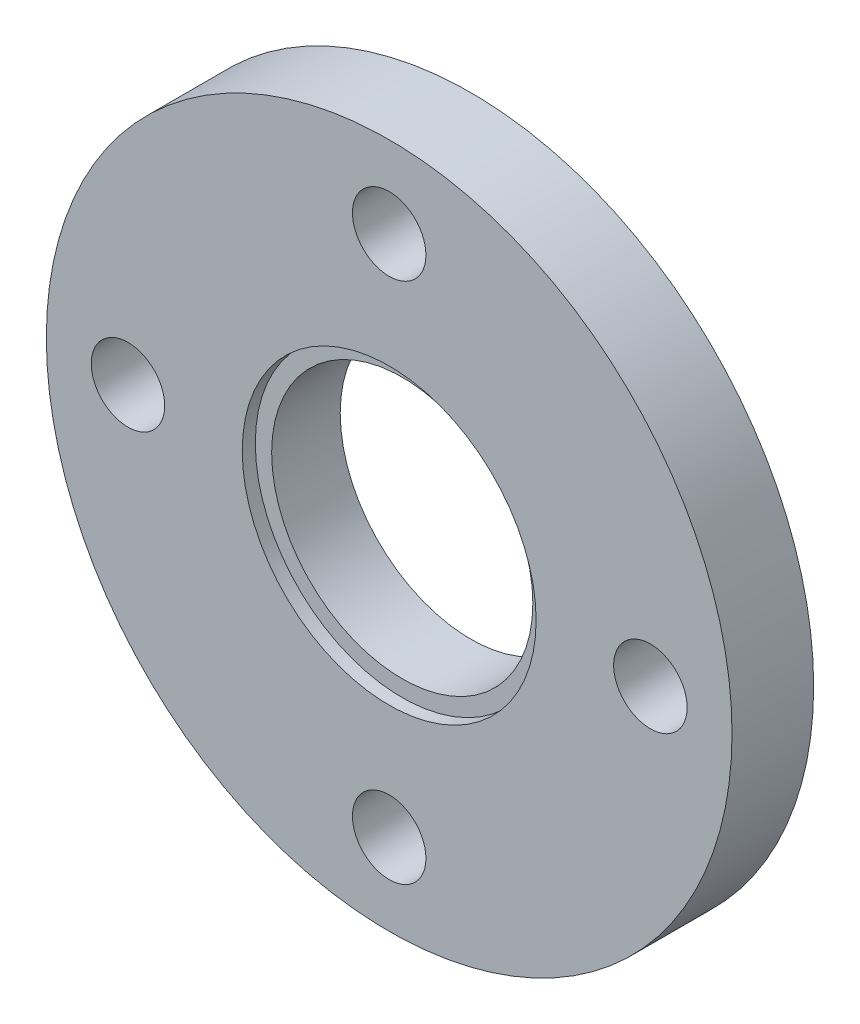
ISO-10303-21;
HEADER;
FILE_DESCRIPTION(('STEP AP214'),'2;1');
FILE_NAME('part.step','',(''),(''),'','','');
FILE_SCHEMA(('AUTOMOTIVE_DESIGN { 1 0 10303 214 1 1 1 1 }'));
ENDSEC;
DATA;
#1=APPLICATION_CONTEXT('core data for automotive mechanical design processes');
#2=APPLICATION_PROTOCOL_DEFINITION('international standard','automotive_design',2000,#1);
#3=PRODUCT_CONTEXT('',#1,'mechanical');
#4=PRODUCT('Part','Part','',(#3));
#5=PRODUCT_RELATED_PRODUCT_CATEGORY('part','',(#4));
#6=PRODUCT_DEFINITION_FORMATION('','',#4);
#7=PRODUCT_DEFINITION_CONTEXT('part definition',#1,'design');
#8=PRODUCT_DEFINITION('design','',#6,#7);
#9=PRODUCT_DEFINITION_SHAPE('','',#8);
#10=(LENGTH_UNIT() NAMED_UNIT(*) SI_UNIT(.MILLI.,.METRE.));
#11=(NAMED_UNIT(*) PLANE_ANGLE_UNIT() SI_UNIT($,.RADIAN.));
#12=(NAMED_UNIT(*) SI_UNIT($,.STERADIAN.) SOLID_ANGLE_UNIT());
#13=UNCERTAINTY_MEASURE_WITH_UNIT(LENGTH_MEASURE(1.E-05),#10,'distance_accuracy_value','');
#14=(GEOMETRIC_REPRESENTATION_CONTEXT(3) GLOBAL_UNCERTAINTY_ASSIGNED_CONTEXT((#13)) GLOBAL_UNIT_ASSIGNED_CONTEXT((#10,
#11,#12)) REPRESENTATION_CONTEXT('',''));
#15=CARTESIAN_POINT('',(0.,0.,0.));
#16=DIRECTION('',(0.,0.,1.));
#17=DIRECTION('',(1.,0.,0.));
#18=AXIS2_PLACEMENT_3D('',#15,#16,#17);
#19=CARTESIAN_POINT('',(0.,0.,5.));
#20=DIRECTION('',(0.,0.,-1.));
#21=DIRECTION('',(-1.,0.,0.));
#22=AXIS2_PLACEMENT_3D('',#19,#20,#21);
#23=CYLINDRICAL_SURFACE('',#22,8.);
#24=CARTESIAN_POINT('',(0.,0.,0.));
#25=DIRECTION('',(0.,0.,1.));
#26=DIRECTION('',(1.,0.,0.));
#27=AXIS2_PLACEMENT_3D('',#24,#25,#26);
#28=CIRCLE('',#27,8.);
#29=CARTESIAN_POINT('',(8.,0.,0.));
#30=VERTEX_POINT('',#29);
#31=EDGE_CURVE('E46',#30,#30,#28,.T.);
#32=ORIENTED_EDGE('',*,*,#31,.F.);
#33=EDGE_LOOP('',(#32));
#34=FACE_BOUND('',#33,.T.);
#35=CARTESIAN_POINT('',(0.,0.,4.2));
#36=DIRECTION('',(0.,0.,1.));
#37=DIRECTION('',(1.,0.,0.));
#38=AXIS2_PLACEMENT_3D('',#35,#36,#37);
#39=CIRCLE('',#38,8.);
#40=CARTESIAN_POINT('',(8.,0.,4.2));
#41=VERTEX_POINT('',#40);
#42=EDGE_CURVE('E37',#41,#41,#39,.T.);
#43=ORIENTED_EDGE('',*,*,#42,.T.);
#44=EDGE_LOOP('',(#43));
#45=FACE_BOUND('',#44,.T.);
#46=ADVANCED_FACE('F33',(#34,#45),#23,.F.);
#47=CARTESIAN_POINT('',(0.,0.,5.));
#48=DIRECTION('',(0.,0.,1.));
#49=DIRECTION('',(1.,0.,0.));
#50=AXIS2_PLACEMENT_3D('',#47,#48,#49);
#51=PLANE('',#50);
#52=CARTESIAN_POINT('',(0.,0.,5.));
#53=DIRECTION('',(0.,0.,1.));
#54=DIRECTION('',(1.,0.,0.));
#55=AXIS2_PLACEMENT_3D('',#52,#53,#54);
#56=CIRCLE('',#55,9.);
#57=CARTESIAN_POINT('',(9.,0.,5.));
#58=VERTEX_POINT('',#57);
#59=EDGE_CURVE('E74',#58,#58,#56,.T.);
#60=ORIENTED_EDGE('',*,*,#59,.F.);
#61=EDGE_LOOP('',(#60));
#62=FACE_BOUND('',#61,.T.);
#63=CARTESIAN_POINT('',(0.,16.,5.));
#64=DIRECTION('',(0.,0.,1.));
#65=DIRECTION('',(1.,0.,0.));
#66=AXIS2_PLACEMENT_3D('',#63,#64,#65);
#67=CIRCLE('',#66,2.24999999999999);
#68=CARTESIAN_POINT('',(2.24999999999999,16.,5.));
#69=VERTEX_POINT('',#68);
#70=EDGE_CURVE('E71',#69,#69,#67,.T.);
#71=ORIENTED_EDGE('',*,*,#70,.F.);
#72=EDGE_LOOP('',(#71));
#73=FACE_BOUND('',#72,.T.);
#74=CARTESIAN_POINT('',(-16.,0.,5.));
#75=DIRECTION('',(0.,0.,1.));
#76=DIRECTION('',(1.,0.,0.));
#77=AXIS2_PLACEMENT_3D('',#74,#75,#76);
#78=CIRCLE('',#77,2.24999999999999);
#79=CARTESIAN_POINT('',(-13.75,0.,5.));
#80=VERTEX_POINT('',#79);
#81=EDGE_CURVE('E65',#80,#80,#78,.T.);
#82=ORIENTED_EDGE('',*,*,#81,.F.);
#83=EDGE_LOOP('',(#82));
#84=FACE_BOUND('',#83,.T.);
#85=CARTESIAN_POINT('',(0.,-16.,5.));
#86=DIRECTION('',(0.,0.,1.));
#87=DIRECTION('',(1.,0.,0.));
#88=AXIS2_PLACEMENT_3D('',#85,#86,#87);
#89=CIRCLE('',#88,2.24999999999999);
#90=CARTESIAN_POINT('',(2.24999999999999,-16.,5.));
#91=VERTEX_POINT('',#90);
#92=EDGE_CURVE('E59',#91,#91,#89,.T.);
#93=ORIENTED_EDGE('',*,*,#92,.F.);
#94=EDGE_LOOP('',(#93));
#95=FACE_BOUND('',#94,.T.);
#96=CARTESIAN_POINT('',(16.,0.,5.));
#97=DIRECTION('',(0.,0.,1.));
#98=DIRECTION('',(1.,0.,0.));
#99=AXIS2_PLACEMENT_3D('',#96,#97,#98);
#100=CIRCLE('',#99,2.24999999999999);
#101=CARTESIAN_POINT('',(18.25,0.,5.));
#102=VERTEX_POINT('',#101);
#103=EDGE_CURVE('E53',#102,#102,#100,.T.);
#104=ORIENTED_EDGE('',*,*,#103,.F.);
#105=EDGE_LOOP('',(#104));
#106=FACE_BOUND('',#105,.T.);
#107=CARTESIAN_POINT('',(0.,0.,5.));
#108=DIRECTION('',(0.,0.,1.));
#109=DIRECTION('',(1.,0.,0.));
#110=AXIS2_PLACEMENT_3D('',#107,#108,#109);
#111=CIRCLE('',#110,21.);
#112=CARTESIAN_POINT('',(21.,0.,5.));
#113=VERTEX_POINT('',#112);
#114=EDGE_CURVE('E10',#113,#113,#111,.T.);
#115=ORIENTED_EDGE('',*,*,#114,.T.);
#116=EDGE_LOOP('',(#115));
#117=FACE_BOUND('',#116,.T.);
#118=ADVANCED_FACE('F96',(#62,#73,#84,#95,#106,#117),#51,.T.);
#119=CARTESIAN_POINT('',(0.,0.,0.));
#120=DIRECTION('',(0.,0.,1.));
#121=DIRECTION('',(1.,0.,0.));
#122=AXIS2_PLACEMENT_3D('',#119,#120,#121);
#123=PLANE('',#122);
#124=CARTESIAN_POINT('',(0.,16.,0.));
#125=DIRECTION('',(0.,0.,1.));
#126=DIRECTION('',(1.,0.,0.));
#127=AXIS2_PLACEMENT_3D('',#124,#125,#126);
#128=CIRCLE('',#127,2.25);
#129=CARTESIAN_POINT('',(2.25,16.,0.));
#130=VERTEX_POINT('',#129);
#131=EDGE_CURVE('E68',#130,#130,#128,.T.);
#132=ORIENTED_EDGE('',*,*,#131,.T.);
#133=EDGE_LOOP('',(#132));
#134=FACE_BOUND('',#133,.T.);
#135=CARTESIAN_POINT('',(-16.,0.,0.));
#136=DIRECTION('',(0.,0.,1.));
#137=DIRECTION('',(1.,0.,0.));
#138=AXIS2_PLACEMENT_3D('',#135,#136,#137);
#139=CIRCLE('',#138,2.25);
#140=CARTESIAN_POINT('',(-13.75,0.,0.));
#141=VERTEX_POINT('',#140);
#142=EDGE_CURVE('E62',#141,#141,#139,.T.);
#143=ORIENTED_EDGE('',*,*,#142,.T.);
#144=EDGE_LOOP('',(#143));
#145=FACE_BOUND('',#144,.T.);
#146=CARTESIAN_POINT('',(0.,-16.,0.));
#147=DIRECTION('',(0.,0.,1.));
#148=DIRECTION('',(1.,0.,0.));
#149=AXIS2_PLACEMENT_3D('',#146,#147,#148);
#150=CIRCLE('',#149,2.25);
#151=CARTESIAN_POINT('',(2.25,-16.,0.));
#152=VERTEX_POINT('',#151);
#153=EDGE_CURVE('E56',#152,#152,#150,.T.);
#154=ORIENTED_EDGE('',*,*,#153,.T.);
#155=EDGE_LOOP('',(#154));
#156=FACE_BOUND('',#155,.T.);
#157=CARTESIAN_POINT('',(16.,0.,0.));
#158=DIRECTION('',(0.,0.,1.));
#159=DIRECTION('',(1.,0.,0.));
#160=AXIS2_PLACEMENT_3D('',#157,#158,#159);
#161=CIRCLE('',#160,2.25);
#162=CARTESIAN_POINT('',(18.25,0.,0.));
#163=VERTEX_POINT('',#162);
#164=EDGE_CURVE('E50',#163,#163,#161,.T.);
#165=ORIENTED_EDGE('',*,*,#164,.T.);
#166=EDGE_LOOP('',(#165));
#167=FACE_BOUND('',#166,.T.);
#168=CARTESIAN_POINT('',(0.,0.,0.));
#169=DIRECTION('',(0.,0.,1.));
#170=DIRECTION('',(1.,0.,0.));
#171=AXIS2_PLACEMENT_3D('',#168,#169,#170);
#172=CIRCLE('',#171,21.);
#173=CARTESIAN_POINT('',(21.,0.,0.));
#174=VERTEX_POINT('',#173);
#175=EDGE_CURVE('E41',#174,#174,#172,.T.);
#176=ORIENTED_EDGE('',*,*,#175,.F.);
#177=EDGE_LOOP('',(#176));
#178=FACE_BOUND('',#177,.T.);
#179=ORIENTED_EDGE('',*,*,#31,.T.);
#180=EDGE_LOOP('',(#179));
#181=FACE_BOUND('',#180,.T.);
#182=ADVANCED_FACE('F102',(#134,#145,#156,#167,#178,#181),#123,.F.);
#183=CARTESIAN_POINT('',(0.,0.,5.));
#184=DIRECTION('',(0.,0.,-1.));
#185=DIRECTION('',(-1.,0.,0.));
#186=AXIS2_PLACEMENT_3D('',#183,#184,#185);
#187=CYLINDRICAL_SURFACE('',#186,21.);
#188=ORIENTED_EDGE('',*,*,#114,.F.);
#189=EDGE_LOOP('',(#188));
#190=FACE_BOUND('',#189,.T.);
#191=ORIENTED_EDGE('',*,*,#175,.T.);
#192=EDGE_LOOP('',(#191));
#193=FACE_BOUND('',#192,.T.);
#194=ADVANCED_FACE('F35',(#190,#193),#187,.T.);
#195=CARTESIAN_POINT('',(16.,0.,5.));
#196=DIRECTION('',(0.,0.,1.));
#197=DIRECTION('',(1.,0.,0.));
#198=AXIS2_PLACEMENT_3D('',#195,#196,#197);
#199=CYLINDRICAL_SURFACE('',#198,2.24999999999999);
#200=ORIENTED_EDGE('',*,*,#164,.F.);
#201=EDGE_LOOP('',(#200));
#202=FACE_BOUND('',#201,.T.);
#203=ORIENTED_EDGE('',*,*,#103,.T.);
#204=EDGE_LOOP('',(#203));
#205=FACE_BOUND('',#204,.T.);
#206=ADVANCED_FACE('F107',(#202,#205),#199,.F.);
#207=CARTESIAN_POINT('',(0.,-16.,5.));
#208=DIRECTION('',(0.,0.,1.));
#209=DIRECTION('',(1.,0.,0.));
#210=AXIS2_PLACEMENT_3D('',#207,#208,#209);
#211=CYLINDRICAL_SURFACE('',#210,2.24999999999999);
#212=ORIENTED_EDGE('',*,*,#153,.F.);
#213=EDGE_LOOP('',(#212));
#214=FACE_BOUND('',#213,.T.);
#215=ORIENTED_EDGE('',*,*,#92,.T.);
#216=EDGE_LOOP('',(#215));
#217=FACE_BOUND('',#216,.T.);
#218=ADVANCED_FACE('F129',(#214,#217),#211,.F.);
#219=CARTESIAN_POINT('',(-16.,0.,5.));
#220=DIRECTION('',(0.,0.,1.));
#221=DIRECTION('',(1.,0.,0.));
#222=AXIS2_PLACEMENT_3D('',#219,#220,#221);
#223=CYLINDRICAL_SURFACE('',#222,2.24999999999999);
#224=ORIENTED_EDGE('',*,*,#142,.F.);
#225=EDGE_LOOP('',(#224));
#226=FACE_BOUND('',#225,.T.);
#227=ORIENTED_EDGE('',*,*,#81,.T.);
#228=EDGE_LOOP('',(#227));
#229=FACE_BOUND('',#228,.T.);
#230=ADVANCED_FACE('F135',(#226,#229),#223,.F.);
#231=CARTESIAN_POINT('',(0.,16.,5.));
#232=DIRECTION('',(0.,0.,1.));
#233=DIRECTION('',(1.,0.,0.));
#234=AXIS2_PLACEMENT_3D('',#231,#232,#233);
#235=CYLINDRICAL_SURFACE('',#234,2.24999999999999);
#236=ORIENTED_EDGE('',*,*,#131,.F.);
#237=EDGE_LOOP('',(#236));
#238=FACE_BOUND('',#237,.T.);
#239=ORIENTED_EDGE('',*,*,#70,.T.);
#240=EDGE_LOOP('',(#239));
#241=FACE_BOUND('',#240,.T.);
#242=ADVANCED_FACE('F92',(#238,#241),#235,.F.);
#243=CARTESIAN_POINT('',(0.,0.,4.2));
#244=DIRECTION('',(0.,0.,1.));
#245=DIRECTION('',(1.,0.,0.));
#246=AXIS2_PLACEMENT_3D('',#243,#244,#245);
#247=CYLINDRICAL_SURFACE('',#246,9.);
#248=CARTESIAN_POINT('',(0.,0.,4.2));
#249=DIRECTION('',(0.,0.,1.));
#250=DIRECTION('',(1.,0.,0.));
#251=AXIS2_PLACEMENT_3D('',#248,#249,#250);
#252=CIRCLE('',#251,9.);
#253=CARTESIAN_POINT('',(9.,0.,4.2));
#254=VERTEX_POINT('',#253);
#255=EDGE_CURVE('E77',#254,#254,#252,.T.);
#256=ORIENTED_EDGE('',*,*,#255,.F.);
#257=EDGE_LOOP('',(#256));
#258=FACE_BOUND('',#257,.T.);
#259=ORIENTED_EDGE('',*,*,#59,.T.);
#260=EDGE_LOOP('',(#259));
#261=FACE_BOUND('',#260,.T.);
#262=ADVANCED_FACE('F87',(#258,#261),#247,.F.);
#263=CARTESIAN_POINT('',(0.,0.,4.2));
#264=DIRECTION('',(0.,0.,1.));
#265=DIRECTION('',(1.,0.,0.));
#266=AXIS2_PLACEMENT_3D('',#263,#264,#265);
#267=PLANE('',#266);
#268=ORIENTED_EDGE('',*,*,#42,.F.);
#269=EDGE_LOOP('',(#268));
#270=FACE_BOUND('',#269,.T.);
#271=ORIENTED_EDGE('',*,*,#255,.T.);
#272=EDGE_LOOP('',(#271));
#273=FACE_BOUND('',#272,.T.);
#274=ADVANCED_FACE('F85',(#270,#273),#267,.T.);
#275=CLOSED_SHELL('',(#46,#118,#182,#194,#206,#218,#230,#242,#262,#274));
#276=MANIFOLD_SOLID_BREP('B2',#275);
#277=ADVANCED_BREP_SHAPE_REPRESENTATION('',(#18,#276),#14);
#278=SHAPE_DEFINITION_REPRESENTATION(#9,#277);
ENDSEC;
END-ISO-10303-21;
